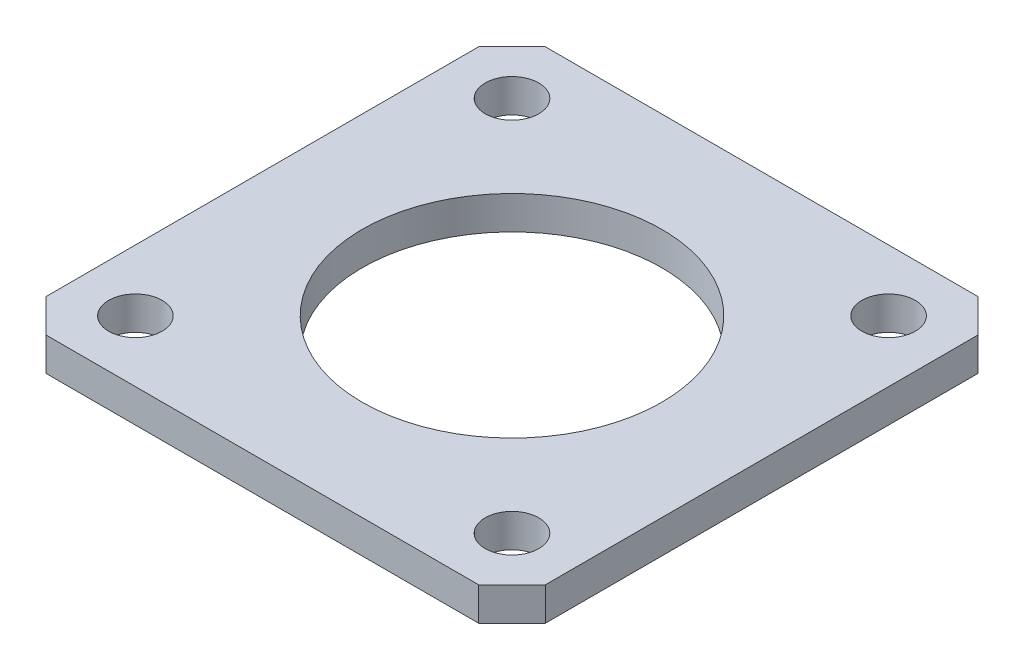
ISO-10303-21;
HEADER;
FILE_DESCRIPTION(('STEP AP214'),'2;1');
FILE_NAME('part.step','',(''),(''),'','','');
FILE_SCHEMA(('AUTOMOTIVE_DESIGN { 1 0 10303 214 1 1 1 1 }'));
ENDSEC;
DATA;
#1=APPLICATION_CONTEXT('core data for automotive mechanical design processes');
#2=APPLICATION_PROTOCOL_DEFINITION('international standard','automotive_design',2000,#1);
#3=PRODUCT_CONTEXT('',#1,'mechanical');
#4=PRODUCT('Part','Part','',(#3));
#5=PRODUCT_RELATED_PRODUCT_CATEGORY('part','',(#4));
#6=PRODUCT_DEFINITION_FORMATION('','',#4);
#7=PRODUCT_DEFINITION_CONTEXT('part definition',#1,'design');
#8=PRODUCT_DEFINITION('design','',#6,#7);
#9=PRODUCT_DEFINITION_SHAPE('','',#8);
#10=(LENGTH_UNIT() NAMED_UNIT(*) SI_UNIT(.MILLI.,.METRE.));
#11=(NAMED_UNIT(*) PLANE_ANGLE_UNIT() SI_UNIT($,.RADIAN.));
#12=(NAMED_UNIT(*) SI_UNIT($,.STERADIAN.) SOLID_ANGLE_UNIT());
#13=UNCERTAINTY_MEASURE_WITH_UNIT(LENGTH_MEASURE(1.E-05),#10,'distance_accuracy_value','');
#14=(GEOMETRIC_REPRESENTATION_CONTEXT(3) GLOBAL_UNCERTAINTY_ASSIGNED_CONTEXT((#13)) GLOBAL_UNIT_ASSIGNED_CONTEXT((#10,
#11,#12)) REPRESENTATION_CONTEXT('',''));
#15=CARTESIAN_POINT('',(0.,0.,0.));
#16=DIRECTION('',(0.,0.,1.));
#17=DIRECTION('',(1.,0.,0.));
#18=AXIS2_PLACEMENT_3D('',#15,#16,#17);
#19=CARTESIAN_POINT('',(44.45,3.175,-47.625));
#20=DIRECTION('',(0.707106781186549,0.,-0.707106781186546));
#21=DIRECTION('',(-0.707106781186546,0.,-0.707106781186549));
#22=AXIS2_PLACEMENT_3D('',#19,#20,#21);
#23=PLANE('',#22);
#24=DIRECTION('',(0.707106781186546,0.,0.707106781186549));
#25=VECTOR('',#24,1.);
#26=CARTESIAN_POINT('',(44.45,0.,-47.625));
#27=LINE('',#26,#25);
#28=CARTESIAN_POINT('',(44.45,0.,-47.625));
#29=VERTEX_POINT('',#28);
#30=CARTESIAN_POINT('',(47.625,0.,-44.45));
#31=VERTEX_POINT('',#30);
#32=EDGE_CURVE('E130',#29,#31,#27,.T.);
#33=ORIENTED_EDGE('',*,*,#32,.F.);
#34=DIRECTION('',(0.,-1.,0.));
#35=VECTOR('',#34,1.);
#36=CARTESIAN_POINT('',(44.45,3.175,-47.625));
#37=LINE('',#36,#35);
#38=CARTESIAN_POINT('',(44.45,3.175,-47.625));
#39=VERTEX_POINT('',#38);
#40=EDGE_CURVE('E11',#39,#29,#37,.T.);
#41=ORIENTED_EDGE('',*,*,#40,.F.);
#42=DIRECTION('',(0.707106781186546,0.,0.707106781186549));
#43=VECTOR('',#42,1.);
#44=CARTESIAN_POINT('',(44.45,3.175,-47.625));
#45=LINE('',#44,#43);
#46=CARTESIAN_POINT('',(47.625,3.175,-44.45));
#47=VERTEX_POINT('',#46);
#48=EDGE_CURVE('E151',#39,#47,#45,.T.);
#49=ORIENTED_EDGE('',*,*,#48,.T.);
#50=DIRECTION('',(0.,-1.,0.));
#51=VECTOR('',#50,1.);
#52=CARTESIAN_POINT('',(47.625,3.175,-44.45));
#53=LINE('',#52,#51);
#54=EDGE_CURVE('E36',#47,#31,#53,.T.);
#55=ORIENTED_EDGE('',*,*,#54,.T.);
#56=EDGE_LOOP('',(#33,#41,#49,#55));
#57=FACE_BOUND('',#56,.T.);
#58=ADVANCED_FACE('F33',(#57),#23,.T.);
#59=CARTESIAN_POINT('',(3.175,3.175,-47.625));
#60=DIRECTION('',(0.,0.,-1.));
#61=DIRECTION('',(-1.,0.,0.));
#62=AXIS2_PLACEMENT_3D('',#59,#60,#61);
#63=PLANE('',#62);
#64=DIRECTION('',(1.,0.,0.));
#65=VECTOR('',#64,1.);
#66=CARTESIAN_POINT('',(3.175,0.,-47.625));
#67=LINE('',#66,#65);
#68=CARTESIAN_POINT('',(3.175,0.,-47.625));
#69=VERTEX_POINT('',#68);
#70=EDGE_CURVE('E149',#69,#29,#67,.T.);
#71=ORIENTED_EDGE('',*,*,#70,.F.);
#72=DIRECTION('',(0.,-1.,0.));
#73=VECTOR('',#72,1.);
#74=CARTESIAN_POINT('',(3.175,3.175,-47.625));
#75=LINE('',#74,#73);
#76=CARTESIAN_POINT('',(3.175,3.175,-47.625));
#77=VERTEX_POINT('',#76);
#78=EDGE_CURVE('E42',#77,#69,#75,.T.);
#79=ORIENTED_EDGE('',*,*,#78,.F.);
#80=DIRECTION('',(1.,0.,0.));
#81=VECTOR('',#80,1.);
#82=CARTESIAN_POINT('',(3.175,3.175,-47.625));
#83=LINE('',#82,#81);
#84=EDGE_CURVE('E120',#77,#39,#83,.T.);
#85=ORIENTED_EDGE('',*,*,#84,.T.);
#86=ORIENTED_EDGE('',*,*,#40,.T.);
#87=EDGE_LOOP('',(#71,#79,#85,#86));
#88=FACE_BOUND('',#87,.T.);
#89=ADVANCED_FACE('F163',(#88),#63,.T.);
#90=CARTESIAN_POINT('',(0.,3.175,-44.45));
#91=DIRECTION('',(-0.707106781186545,0.,-0.70710678118655));
#92=DIRECTION('',(-0.70710678118655,0.,0.707106781186545));
#93=AXIS2_PLACEMENT_3D('',#90,#91,#92);
#94=PLANE('',#93);
#95=DIRECTION('',(0.70710678118655,0.,-0.707106781186545));
#96=VECTOR('',#95,1.);
#97=CARTESIAN_POINT('',(0.,0.,-44.45));
#98=LINE('',#97,#96);
#99=CARTESIAN_POINT('',(0.,0.,-44.45));
#100=VERTEX_POINT('',#99);
#101=EDGE_CURVE('E107',#100,#69,#98,.T.);
#102=ORIENTED_EDGE('',*,*,#101,.F.);
#103=DIRECTION('',(0.,-1.,0.));
#104=VECTOR('',#103,1.);
#105=CARTESIAN_POINT('',(0.,3.175,-44.45));
#106=LINE('',#105,#104);
#107=CARTESIAN_POINT('',(0.,3.175,-44.45));
#108=VERTEX_POINT('',#107);
#109=EDGE_CURVE('E102',#108,#100,#106,.T.);
#110=ORIENTED_EDGE('',*,*,#109,.F.);
#111=DIRECTION('',(0.70710678118655,0.,-0.707106781186545));
#112=VECTOR('',#111,1.);
#113=CARTESIAN_POINT('',(0.,3.175,-44.45));
#114=LINE('',#113,#112);
#115=EDGE_CURVE('E105',#108,#77,#114,.T.);
#116=ORIENTED_EDGE('',*,*,#115,.T.);
#117=ORIENTED_EDGE('',*,*,#78,.T.);
#118=EDGE_LOOP('',(#102,#110,#116,#117));
#119=FACE_BOUND('',#118,.T.);
#120=ADVANCED_FACE('F104',(#119),#94,.T.);
#121=CARTESIAN_POINT('',(0.,3.175,-3.17500000000001));
#122=DIRECTION('',(-1.,0.,0.));
#123=DIRECTION('',(0.,0.,1.));
#124=AXIS2_PLACEMENT_3D('',#121,#122,#123);
#125=PLANE('',#124);
#126=DIRECTION('',(0.,0.,-1.));
#127=VECTOR('',#126,1.);
#128=CARTESIAN_POINT('',(0.,0.,-3.17500000000001));
#129=LINE('',#128,#127);
#130=CARTESIAN_POINT('',(0.,0.,-3.17500000000001));
#131=VERTEX_POINT('',#130);
#132=EDGE_CURVE('E146',#131,#100,#129,.T.);
#133=ORIENTED_EDGE('',*,*,#132,.F.);
#134=DIRECTION('',(0.,-1.,0.));
#135=VECTOR('',#134,1.);
#136=CARTESIAN_POINT('',(0.,3.175,-3.17500000000001));
#137=LINE('',#136,#135);
#138=CARTESIAN_POINT('',(0.,3.175,-3.17500000000001));
#139=VERTEX_POINT('',#138);
#140=EDGE_CURVE('E112',#139,#131,#137,.T.);
#141=ORIENTED_EDGE('',*,*,#140,.F.);
#142=DIRECTION('',(0.,0.,-1.));
#143=VECTOR('',#142,1.);
#144=CARTESIAN_POINT('',(0.,3.175,-3.17500000000001));
#145=LINE('',#144,#143);
#146=EDGE_CURVE('E118',#139,#108,#145,.T.);
#147=ORIENTED_EDGE('',*,*,#146,.T.);
#148=ORIENTED_EDGE('',*,*,#109,.T.);
#149=EDGE_LOOP('',(#133,#141,#147,#148));
#150=FACE_BOUND('',#149,.T.);
#151=ADVANCED_FACE('F122',(#150),#125,.T.);
#152=CARTESIAN_POINT('',(3.175,3.175,0.));
#153=DIRECTION('',(-0.707106781186548,0.,0.707106781186547));
#154=DIRECTION('',(0.707106781186547,0.,0.707106781186548));
#155=AXIS2_PLACEMENT_3D('',#152,#153,#154);
#156=PLANE('',#155);
#157=DIRECTION('',(-0.707106781186547,0.,-0.707106781186548));
#158=VECTOR('',#157,1.);
#159=CARTESIAN_POINT('',(3.175,0.,0.));
#160=LINE('',#159,#158);
#161=CARTESIAN_POINT('',(3.175,0.,0.));
#162=VERTEX_POINT('',#161);
#163=EDGE_CURVE('E143',#162,#131,#160,.T.);
#164=ORIENTED_EDGE('',*,*,#163,.F.);
#165=DIRECTION('',(0.,-1.,0.));
#166=VECTOR('',#165,1.);
#167=CARTESIAN_POINT('',(3.175,3.175,0.));
#168=LINE('',#167,#166);
#169=CARTESIAN_POINT('',(3.175,3.175,0.));
#170=VERTEX_POINT('',#169);
#171=EDGE_CURVE('E155',#170,#162,#168,.T.);
#172=ORIENTED_EDGE('',*,*,#171,.F.);
#173=DIRECTION('',(-0.707106781186547,0.,-0.707106781186548));
#174=VECTOR('',#173,1.);
#175=CARTESIAN_POINT('',(3.175,3.175,0.));
#176=LINE('',#175,#174);
#177=EDGE_CURVE('E123',#170,#139,#176,.T.);
#178=ORIENTED_EDGE('',*,*,#177,.T.);
#179=ORIENTED_EDGE('',*,*,#140,.T.);
#180=EDGE_LOOP('',(#164,#172,#178,#179));
#181=FACE_BOUND('',#180,.T.);
#182=ADVANCED_FACE('F176',(#181),#156,.T.);
#183=CARTESIAN_POINT('',(44.45,3.175,0.));
#184=DIRECTION('',(0.,0.,1.));
#185=DIRECTION('',(1.,0.,0.));
#186=AXIS2_PLACEMENT_3D('',#183,#184,#185);
#187=PLANE('',#186);
#188=DIRECTION('',(-1.,0.,0.));
#189=VECTOR('',#188,1.);
#190=CARTESIAN_POINT('',(44.45,0.,0.));
#191=LINE('',#190,#189);
#192=CARTESIAN_POINT('',(44.45,0.,0.));
#193=VERTEX_POINT('',#192);
#194=EDGE_CURVE('E140',#193,#162,#191,.T.);
#195=ORIENTED_EDGE('',*,*,#194,.F.);
#196=DIRECTION('',(0.,-1.,0.));
#197=VECTOR('',#196,1.);
#198=CARTESIAN_POINT('',(44.45,3.175,0.));
#199=LINE('',#198,#197);
#200=CARTESIAN_POINT('',(44.45,3.175,0.));
#201=VERTEX_POINT('',#200);
#202=EDGE_CURVE('E157',#201,#193,#199,.T.);
#203=ORIENTED_EDGE('',*,*,#202,.F.);
#204=DIRECTION('',(-1.,0.,0.));
#205=VECTOR('',#204,1.);
#206=CARTESIAN_POINT('',(44.45,3.175,0.));
#207=LINE('',#206,#205);
#208=EDGE_CURVE('E125',#201,#170,#207,.T.);
#209=ORIENTED_EDGE('',*,*,#208,.T.);
#210=ORIENTED_EDGE('',*,*,#171,.T.);
#211=EDGE_LOOP('',(#195,#203,#209,#210));
#212=FACE_BOUND('',#211,.T.);
#213=ADVANCED_FACE('F179',(#212),#187,.T.);
#214=CARTESIAN_POINT('',(47.625,3.175,-3.175));
#215=DIRECTION('',(0.707106781186547,0.,0.707106781186548));
#216=DIRECTION('',(0.707106781186548,0.,-0.707106781186547));
#217=AXIS2_PLACEMENT_3D('',#214,#215,#216);
#218=PLANE('',#217);
#219=DIRECTION('',(-0.707106781186548,0.,0.707106781186547));
#220=VECTOR('',#219,1.);
#221=CARTESIAN_POINT('',(47.625,0.,-3.175));
#222=LINE('',#221,#220);
#223=CARTESIAN_POINT('',(47.625,0.,-3.175));
#224=VERTEX_POINT('',#223);
#225=EDGE_CURVE('E137',#224,#193,#222,.T.);
#226=ORIENTED_EDGE('',*,*,#225,.F.);
#227=DIRECTION('',(0.,-1.,0.));
#228=VECTOR('',#227,1.);
#229=CARTESIAN_POINT('',(47.625,3.175,-3.175));
#230=LINE('',#229,#228);
#231=CARTESIAN_POINT('',(47.625,3.175,-3.175));
#232=VERTEX_POINT('',#231);
#233=EDGE_CURVE('E158',#232,#224,#230,.T.);
#234=ORIENTED_EDGE('',*,*,#233,.F.);
#235=DIRECTION('',(-0.707106781186548,0.,0.707106781186547));
#236=VECTOR('',#235,1.);
#237=CARTESIAN_POINT('',(47.625,3.175,-3.175));
#238=LINE('',#237,#236);
#239=EDGE_CURVE('E255',#232,#201,#238,.T.);
#240=ORIENTED_EDGE('',*,*,#239,.T.);
#241=ORIENTED_EDGE('',*,*,#202,.T.);
#242=EDGE_LOOP('',(#226,#234,#240,#241));
#243=FACE_BOUND('',#242,.T.);
#244=ADVANCED_FACE('F183',(#243),#218,.T.);
#245=CARTESIAN_POINT('',(47.625,3.175,-44.45));
#246=DIRECTION('',(1.,0.,0.));
#247=DIRECTION('',(0.,0.,-1.));
#248=AXIS2_PLACEMENT_3D('',#245,#246,#247);
#249=PLANE('',#248);
#250=DIRECTION('',(0.,0.,1.));
#251=VECTOR('',#250,1.);
#252=CARTESIAN_POINT('',(47.625,0.,-44.45));
#253=LINE('',#252,#251);
#254=EDGE_CURVE('E133',#31,#224,#253,.T.);
#255=ORIENTED_EDGE('',*,*,#254,.F.);
#256=ORIENTED_EDGE('',*,*,#54,.F.);
#257=DIRECTION('',(0.,0.,1.));
#258=VECTOR('',#257,1.);
#259=CARTESIAN_POINT('',(47.625,3.175,-44.45));
#260=LINE('',#259,#258);
#261=EDGE_CURVE('E253',#47,#232,#260,.T.);
#262=ORIENTED_EDGE('',*,*,#261,.T.);
#263=ORIENTED_EDGE('',*,*,#233,.T.);
#264=EDGE_LOOP('',(#255,#256,#262,#263));
#265=FACE_BOUND('',#264,.T.);
#266=ADVANCED_FACE('F160',(#265),#249,.T.);
#267=CARTESIAN_POINT('',(0.,3.175,0.));
#268=DIRECTION('',(0.,-1.,0.));
#269=DIRECTION('',(0.,0.,-1.));
#270=AXIS2_PLACEMENT_3D('',#267,#268,#269);
#271=PLANE('',#270);
#272=CARTESIAN_POINT('',(41.7730122421383,3.175,-5.85198775786169));
#273=DIRECTION('',(0.,-1.,0.));
#274=DIRECTION('',(0.,0.,1.));
#275=AXIS2_PLACEMENT_3D('',#272,#273,#274);
#276=CIRCLE('',#275,2.5527);
#277=CARTESIAN_POINT('',(41.7730122421383,3.175,-3.2992877578617));
#278=VERTEX_POINT('',#277);
#279=EDGE_CURVE('E222',#278,#278,#276,.T.);
#280=ORIENTED_EDGE('',*,*,#279,.T.);
#281=EDGE_LOOP('',(#280));
#282=FACE_BOUND('',#281,.T.);
#283=CARTESIAN_POINT('',(5.85198775786169,3.175,-41.7730122421383));
#284=DIRECTION('',(0.,-1.,0.));
#285=DIRECTION('',(0.,0.,1.));
#286=AXIS2_PLACEMENT_3D('',#283,#284,#285);
#287=CIRCLE('',#286,2.55270000000001);
#288=CARTESIAN_POINT('',(5.85198775786169,3.175,-39.2203122421383));
#289=VERTEX_POINT('',#288);
#290=EDGE_CURVE('E230',#289,#289,#287,.T.);
#291=ORIENTED_EDGE('',*,*,#290,.T.);
#292=EDGE_LOOP('',(#291));
#293=FACE_BOUND('',#292,.T.);
#294=CARTESIAN_POINT('',(23.8125,3.175,-23.8125));
#295=DIRECTION('',(0.,-1.,0.));
#296=DIRECTION('',(0.,0.,1.));
#297=AXIS2_PLACEMENT_3D('',#294,#295,#296);
#298=CIRCLE('',#297,14.2875);
#299=CARTESIAN_POINT('',(23.8125,3.175,-9.525));
#300=VERTEX_POINT('',#299);
#301=EDGE_CURVE('E236',#300,#300,#298,.T.);
#302=ORIENTED_EDGE('',*,*,#301,.T.);
#303=EDGE_LOOP('',(#302));
#304=FACE_BOUND('',#303,.T.);
#305=CARTESIAN_POINT('',(41.7730122421383,3.175,-41.7730122421383));
#306=DIRECTION('',(0.,-1.,0.));
#307=DIRECTION('',(0.,0.,1.));
#308=AXIS2_PLACEMENT_3D('',#305,#306,#307);
#309=CIRCLE('',#308,2.5527);
#310=CARTESIAN_POINT('',(41.7730122421383,3.175,-39.2203122421383));
#311=VERTEX_POINT('',#310);
#312=EDGE_CURVE('E242',#311,#311,#309,.T.);
#313=ORIENTED_EDGE('',*,*,#312,.T.);
#314=EDGE_LOOP('',(#313));
#315=FACE_BOUND('',#314,.T.);
#316=CARTESIAN_POINT('',(5.85198775786169,3.175,-5.85198775786169));
#317=DIRECTION('',(0.,-1.,0.));
#318=DIRECTION('',(0.,0.,1.));
#319=AXIS2_PLACEMENT_3D('',#316,#317,#318);
#320=CIRCLE('',#319,2.5527);
#321=CARTESIAN_POINT('',(5.85198775786169,3.175,-3.29928775786169));
#322=VERTEX_POINT('',#321);
#323=EDGE_CURVE('E134',#322,#322,#320,.T.);
#324=ORIENTED_EDGE('',*,*,#323,.T.);
#325=EDGE_LOOP('',(#324));
#326=FACE_BOUND('',#325,.T.);
#327=ORIENTED_EDGE('',*,*,#48,.F.);
#328=ORIENTED_EDGE('',*,*,#84,.F.);
#329=ORIENTED_EDGE('',*,*,#115,.F.);
#330=ORIENTED_EDGE('',*,*,#146,.F.);
#331=ORIENTED_EDGE('',*,*,#177,.F.);
#332=ORIENTED_EDGE('',*,*,#208,.F.);
#333=ORIENTED_EDGE('',*,*,#239,.F.);
#334=ORIENTED_EDGE('',*,*,#261,.F.);
#335=EDGE_LOOP('',(#327,#328,#329,#330,#331,#332,#333,#334));
#336=FACE_BOUND('',#335,.T.);
#337=ADVANCED_FACE('F116',(#282,#293,#304,#315,#326,#336),#271,.F.);
#338=CARTESIAN_POINT('',(0.,0.,0.));
#339=DIRECTION('',(0.,-1.,0.));
#340=DIRECTION('',(0.,0.,-1.));
#341=AXIS2_PLACEMENT_3D('',#338,#339,#340);
#342=PLANE('',#341);
#343=CARTESIAN_POINT('',(41.7730122421383,0.,-5.85198775786169));
#344=DIRECTION('',(0.,-1.,0.));
#345=DIRECTION('',(0.,0.,1.));
#346=AXIS2_PLACEMENT_3D('',#343,#344,#345);
#347=CIRCLE('',#346,2.5527);
#348=CARTESIAN_POINT('',(41.7730122421383,0.,-3.2992877578617));
#349=VERTEX_POINT('',#348);
#350=EDGE_CURVE('E225',#349,#349,#347,.T.);
#351=ORIENTED_EDGE('',*,*,#350,.F.);
#352=EDGE_LOOP('',(#351));
#353=FACE_BOUND('',#352,.T.);
#354=CARTESIAN_POINT('',(5.85198775786169,0.,-41.7730122421383));
#355=DIRECTION('',(0.,-1.,0.));
#356=DIRECTION('',(0.,0.,1.));
#357=AXIS2_PLACEMENT_3D('',#354,#355,#356);
#358=CIRCLE('',#357,2.55270000000001);
#359=CARTESIAN_POINT('',(5.85198775786169,0.,-39.2203122421383));
#360=VERTEX_POINT('',#359);
#361=EDGE_CURVE('E227',#360,#360,#358,.T.);
#362=ORIENTED_EDGE('',*,*,#361,.F.);
#363=EDGE_LOOP('',(#362));
#364=FACE_BOUND('',#363,.T.);
#365=CARTESIAN_POINT('',(23.8125,0.,-23.8125));
#366=DIRECTION('',(0.,-1.,0.));
#367=DIRECTION('',(0.,0.,1.));
#368=AXIS2_PLACEMENT_3D('',#365,#366,#367);
#369=CIRCLE('',#368,14.2875);
#370=CARTESIAN_POINT('',(23.8125,0.,-9.525));
#371=VERTEX_POINT('',#370);
#372=EDGE_CURVE('E233',#371,#371,#369,.T.);
#373=ORIENTED_EDGE('',*,*,#372,.F.);
#374=EDGE_LOOP('',(#373));
#375=FACE_BOUND('',#374,.T.);
#376=CARTESIAN_POINT('',(41.7730122421383,0.,-41.7730122421383));
#377=DIRECTION('',(0.,-1.,0.));
#378=DIRECTION('',(0.,0.,1.));
#379=AXIS2_PLACEMENT_3D('',#376,#377,#378);
#380=CIRCLE('',#379,2.5527);
#381=CARTESIAN_POINT('',(41.7730122421383,0.,-39.2203122421383));
#382=VERTEX_POINT('',#381);
#383=EDGE_CURVE('E239',#382,#382,#380,.T.);
#384=ORIENTED_EDGE('',*,*,#383,.F.);
#385=EDGE_LOOP('',(#384));
#386=FACE_BOUND('',#385,.T.);
#387=CARTESIAN_POINT('',(5.85198775786169,0.,-5.85198775786169));
#388=DIRECTION('',(0.,-1.,0.));
#389=DIRECTION('',(0.,0.,1.));
#390=AXIS2_PLACEMENT_3D('',#387,#388,#389);
#391=CIRCLE('',#390,2.5527);
#392=CARTESIAN_POINT('',(5.85198775786169,0.,-3.29928775786169));
#393=VERTEX_POINT('',#392);
#394=EDGE_CURVE('E245',#393,#393,#391,.T.);
#395=ORIENTED_EDGE('',*,*,#394,.F.);
#396=EDGE_LOOP('',(#395));
#397=FACE_BOUND('',#396,.T.);
#398=ORIENTED_EDGE('',*,*,#32,.T.);
#399=ORIENTED_EDGE('',*,*,#254,.T.);
#400=ORIENTED_EDGE('',*,*,#225,.T.);
#401=ORIENTED_EDGE('',*,*,#194,.T.);
#402=ORIENTED_EDGE('',*,*,#163,.T.);
#403=ORIENTED_EDGE('',*,*,#132,.T.);
#404=ORIENTED_EDGE('',*,*,#101,.T.);
#405=ORIENTED_EDGE('',*,*,#70,.T.);
#406=EDGE_LOOP('',(#398,#399,#400,#401,#402,#403,#404,#405));
#407=FACE_BOUND('',#406,.T.);
#408=ADVANCED_FACE('F162',(#353,#364,#375,#386,#397,#407),#342,.T.);
#409=CARTESIAN_POINT('',(5.85198775786169,3.175,-5.85198775786169));
#410=DIRECTION('',(0.,-1.,0.));
#411=DIRECTION('',(0.,0.,-1.));
#412=AXIS2_PLACEMENT_3D('',#409,#410,#411);
#413=CYLINDRICAL_SURFACE('',#412,2.5527);
#414=ORIENTED_EDGE('',*,*,#323,.F.);
#415=EDGE_LOOP('',(#414));
#416=FACE_BOUND('',#415,.T.);
#417=ORIENTED_EDGE('',*,*,#394,.T.);
#418=EDGE_LOOP('',(#417));
#419=FACE_BOUND('',#418,.T.);
#420=ADVANCED_FACE('F195',(#416,#419),#413,.F.);
#421=CARTESIAN_POINT('',(41.7730122421383,3.175,-41.7730122421383));
#422=DIRECTION('',(0.,-1.,0.));
#423=DIRECTION('',(0.,0.,-1.));
#424=AXIS2_PLACEMENT_3D('',#421,#422,#423);
#425=CYLINDRICAL_SURFACE('',#424,2.5527);
#426=ORIENTED_EDGE('',*,*,#312,.F.);
#427=EDGE_LOOP('',(#426));
#428=FACE_BOUND('',#427,.T.);
#429=ORIENTED_EDGE('',*,*,#383,.T.);
#430=EDGE_LOOP('',(#429));
#431=FACE_BOUND('',#430,.T.);
#432=ADVANCED_FACE('F202',(#428,#431),#425,.F.);
#433=CARTESIAN_POINT('',(23.8125,3.175,-23.8125));
#434=DIRECTION('',(0.,-1.,0.));
#435=DIRECTION('',(0.,0.,-1.));
#436=AXIS2_PLACEMENT_3D('',#433,#434,#435);
#437=CYLINDRICAL_SURFACE('',#436,14.2875);
#438=ORIENTED_EDGE('',*,*,#301,.F.);
#439=EDGE_LOOP('',(#438));
#440=FACE_BOUND('',#439,.T.);
#441=ORIENTED_EDGE('',*,*,#372,.T.);
#442=EDGE_LOOP('',(#441));
#443=FACE_BOUND('',#442,.T.);
#444=ADVANCED_FACE('F206',(#440,#443),#437,.F.);
#445=CARTESIAN_POINT('',(5.85198775786169,3.175,-41.7730122421383));
#446=DIRECTION('',(0.,-1.,0.));
#447=DIRECTION('',(0.,0.,-1.));
#448=AXIS2_PLACEMENT_3D('',#445,#446,#447);
#449=CYLINDRICAL_SURFACE('',#448,2.55270000000001);
#450=ORIENTED_EDGE('',*,*,#290,.F.);
#451=EDGE_LOOP('',(#450));
#452=FACE_BOUND('',#451,.T.);
#453=ORIENTED_EDGE('',*,*,#361,.T.);
#454=EDGE_LOOP('',(#453));
#455=FACE_BOUND('',#454,.T.);
#456=ADVANCED_FACE('F210',(#452,#455),#449,.F.);
#457=CARTESIAN_POINT('',(41.7730122421383,3.175,-5.85198775786169));
#458=DIRECTION('',(0.,-1.,0.));
#459=DIRECTION('',(0.,0.,-1.));
#460=AXIS2_PLACEMENT_3D('',#457,#458,#459);
#461=CYLINDRICAL_SURFACE('',#460,2.5527);
#462=ORIENTED_EDGE('',*,*,#279,.F.);
#463=EDGE_LOOP('',(#462));
#464=FACE_BOUND('',#463,.T.);
#465=ORIENTED_EDGE('',*,*,#350,.T.);
#466=EDGE_LOOP('',(#465));
#467=FACE_BOUND('',#466,.T.);
#468=ADVANCED_FACE('F214',(#464,#467),#461,.F.);
#469=CLOSED_SHELL('',(#58,#89,#120,#151,#182,#213,#244,#266,#337,#408,#420,#432,#444,#456,#468));
#470=MANIFOLD_SOLID_BREP('B2',#469);
#471=ADVANCED_BREP_SHAPE_REPRESENTATION('',(#18,#470),#14);
#472=SHAPE_DEFINITION_REPRESENTATION(#9,#471);
ENDSEC;
END-ISO-10303-21;
